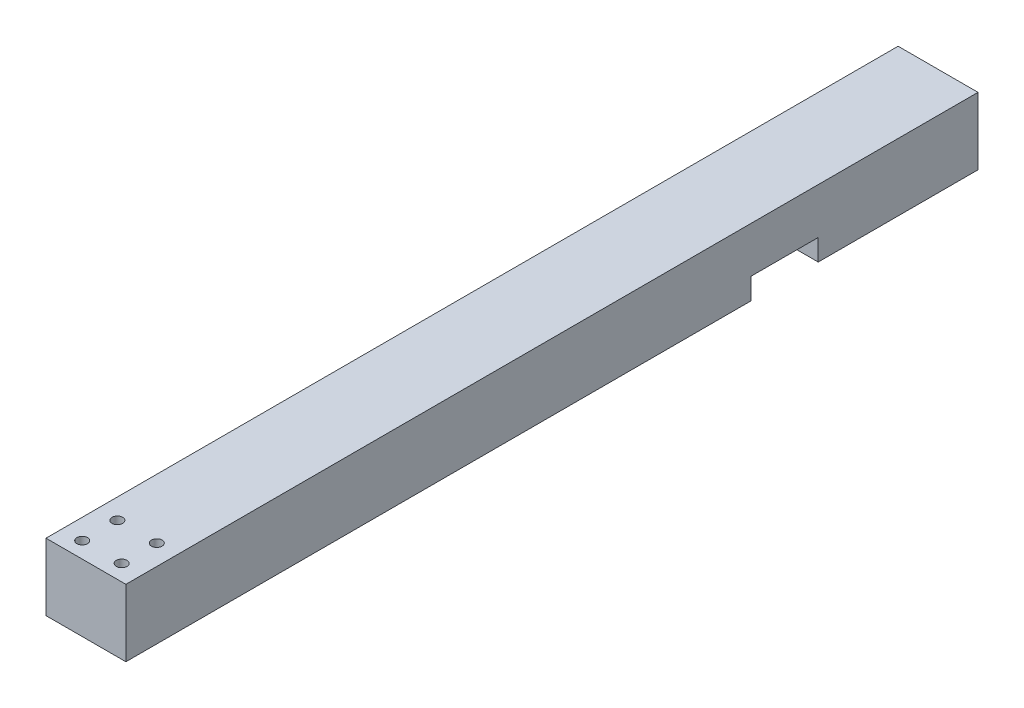
ISO-10303-21;
HEADER;
FILE_DESCRIPTION(('STEP AP214'),'2;1');
FILE_NAME('part.step','',(''),(''),'','','');
FILE_SCHEMA(('AUTOMOTIVE_DESIGN { 1 0 10303 214 1 1 1 1 }'));
ENDSEC;
DATA;
#1=APPLICATION_CONTEXT('core data for automotive mechanical design processes');
#2=APPLICATION_PROTOCOL_DEFINITION('international standard','automotive_design',2000,#1);
#3=PRODUCT_CONTEXT('',#1,'mechanical');
#4=PRODUCT('Part','Part','',(#3));
#5=PRODUCT_RELATED_PRODUCT_CATEGORY('part','',(#4));
#6=PRODUCT_DEFINITION_FORMATION('','',#4);
#7=PRODUCT_DEFINITION_CONTEXT('part definition',#1,'design');
#8=PRODUCT_DEFINITION('design','',#6,#7);
#9=PRODUCT_DEFINITION_SHAPE('','',#8);
#10=(LENGTH_UNIT() NAMED_UNIT(*) SI_UNIT(.MILLI.,.METRE.));
#11=(NAMED_UNIT(*) PLANE_ANGLE_UNIT() SI_UNIT($,.RADIAN.));
#12=(NAMED_UNIT(*) SI_UNIT($,.STERADIAN.) SOLID_ANGLE_UNIT());
#13=UNCERTAINTY_MEASURE_WITH_UNIT(LENGTH_MEASURE(1.E-05),#10,'distance_accuracy_value','');
#14=(GEOMETRIC_REPRESENTATION_CONTEXT(3) GLOBAL_UNCERTAINTY_ASSIGNED_CONTEXT((#13)) GLOBAL_UNIT_ASSIGNED_CONTEXT((#10,
#11,#12)) REPRESENTATION_CONTEXT('',''));
#15=CARTESIAN_POINT('',(0.,0.,0.));
#16=DIRECTION('',(0.,0.,1.));
#17=DIRECTION('',(1.,0.,0.));
#18=AXIS2_PLACEMENT_3D('',#15,#16,#17);
#19=CARTESIAN_POINT('',(0.,0.,800.));
#20=DIRECTION('',(0.,1.,0.));
#21=DIRECTION('',(0.,0.,1.));
#22=AXIS2_PLACEMENT_3D('',#19,#20,#21);
#23=PLANE('',#22);
#24=CARTESIAN_POINT('',(19.,0.,752.));
#25=DIRECTION('',(0.,-1.,0.));
#26=DIRECTION('',(0.,0.,-1.));
#27=AXIS2_PLACEMENT_3D('',#24,#25,#26);
#28=CIRCLE('',#27,5.);
#29=CARTESIAN_POINT('',(19.,0.,747.));
#30=VERTEX_POINT('',#29);
#31=EDGE_CURVE('E135',#30,#30,#28,.T.);
#32=ORIENTED_EDGE('',*,*,#31,.F.);
#33=EDGE_LOOP('',(#32));
#34=FACE_BOUND('',#33,.T.);
#35=CARTESIAN_POINT('',(56.,0.,752.));
#36=DIRECTION('',(0.,-1.,0.));
#37=DIRECTION('',(0.,0.,1.));
#38=AXIS2_PLACEMENT_3D('',#35,#36,#37);
#39=CIRCLE('',#38,5.00000000000001);
#40=CARTESIAN_POINT('',(56.,0.,757.));
#41=VERTEX_POINT('',#40);
#42=EDGE_CURVE('E148',#41,#41,#39,.T.);
#43=ORIENTED_EDGE('',*,*,#42,.F.);
#44=EDGE_LOOP('',(#43));
#45=FACE_BOUND('',#44,.T.);
#46=CARTESIAN_POINT('',(56.,0.,785.));
#47=DIRECTION('',(0.,-1.,0.));
#48=DIRECTION('',(0.,0.,1.));
#49=AXIS2_PLACEMENT_3D('',#46,#47,#48);
#50=CIRCLE('',#49,5.00000000000001);
#51=CARTESIAN_POINT('',(56.,0.,790.));
#52=VERTEX_POINT('',#51);
#53=EDGE_CURVE('E142',#52,#52,#50,.T.);
#54=ORIENTED_EDGE('',*,*,#53,.F.);
#55=EDGE_LOOP('',(#54));
#56=FACE_BOUND('',#55,.T.);
#57=CARTESIAN_POINT('',(19.,0.,785.));
#58=DIRECTION('',(0.,-1.,0.));
#59=DIRECTION('',(0.,0.,-1.));
#60=AXIS2_PLACEMENT_3D('',#57,#58,#59);
#61=CIRCLE('',#60,5.);
#62=CARTESIAN_POINT('',(19.,0.,780.));
#63=VERTEX_POINT('',#62);
#64=EDGE_CURVE('E136',#63,#63,#61,.T.);
#65=ORIENTED_EDGE('',*,*,#64,.F.);
#66=EDGE_LOOP('',(#65));
#67=FACE_BOUND('',#66,.T.);
#68=DIRECTION('',(0.,0.,-1.));
#69=VECTOR('',#68,1.);
#70=CARTESIAN_POINT('',(0.,0.,800.));
#71=LINE('',#70,#69);
#72=CARTESIAN_POINT('',(0.,0.,800.));
#73=VERTEX_POINT('',#72);
#74=CARTESIAN_POINT('',(0.,0.,213.));
#75=VERTEX_POINT('',#74);
#76=EDGE_CURVE('E11',#73,#75,#71,.T.);
#77=ORIENTED_EDGE('',*,*,#76,.T.);
#78=DIRECTION('',(-1.,0.,0.));
#79=VECTOR('',#78,1.);
#80=CARTESIAN_POINT('',(0.,0.,213.));
#81=LINE('',#80,#79);
#82=CARTESIAN_POINT('',(75.,0.,213.));
#83=VERTEX_POINT('',#82);
#84=EDGE_CURVE('E122',#83,#75,#81,.T.);
#85=ORIENTED_EDGE('',*,*,#84,.F.);
#86=DIRECTION('',(0.,0.,-1.));
#87=VECTOR('',#86,1.);
#88=CARTESIAN_POINT('',(75.,0.,800.));
#89=LINE('',#88,#87);
#90=CARTESIAN_POINT('',(75.,0.,800.));
#91=VERTEX_POINT('',#90);
#92=EDGE_CURVE('E175',#91,#83,#89,.T.);
#93=ORIENTED_EDGE('',*,*,#92,.F.);
#94=DIRECTION('',(1.,0.,0.));
#95=VECTOR('',#94,1.);
#96=CARTESIAN_POINT('',(0.,0.,800.));
#97=LINE('',#96,#95);
#98=EDGE_CURVE('E85',#73,#91,#97,.T.);
#99=ORIENTED_EDGE('',*,*,#98,.F.);
#100=EDGE_LOOP('',(#77,#85,#93,#99));
#101=FACE_BOUND('',#100,.T.);
#102=ADVANCED_FACE('F33',(#34,#45,#56,#67,#101),#23,.F.);
#103=CARTESIAN_POINT('',(0.,0.,800.));
#104=DIRECTION('',(1.,0.,0.));
#105=DIRECTION('',(0.,0.,-1.));
#106=AXIS2_PLACEMENT_3D('',#103,#104,#105);
#107=PLANE('',#106);
#108=DIRECTION('',(0.,0.,-1.));
#109=VECTOR('',#108,1.);
#110=CARTESIAN_POINT('',(0.,20.,150.));
#111=LINE('',#110,#109);
#112=CARTESIAN_POINT('',(0.,20.,213.));
#113=VERTEX_POINT('',#112);
#114=CARTESIAN_POINT('',(0.,20.,150.));
#115=VERTEX_POINT('',#114);
#116=EDGE_CURVE('E113',#113,#115,#111,.T.);
#117=ORIENTED_EDGE('',*,*,#116,.F.);
#118=DIRECTION('',(0.,-1.,0.));
#119=VECTOR('',#118,1.);
#120=CARTESIAN_POINT('',(0.,20.,213.));
#121=LINE('',#120,#119);
#122=EDGE_CURVE('E151',#113,#75,#121,.T.);
#123=ORIENTED_EDGE('',*,*,#122,.T.);
#124=ORIENTED_EDGE('',*,*,#76,.F.);
#125=DIRECTION('',(0.,-1.,0.));
#126=VECTOR('',#125,1.);
#127=CARTESIAN_POINT('',(0.,0.,800.));
#128=LINE('',#127,#126);
#129=CARTESIAN_POINT('',(0.,63.,800.));
#130=VERTEX_POINT('',#129);
#131=EDGE_CURVE('E158',#130,#73,#128,.T.);
#132=ORIENTED_EDGE('',*,*,#131,.F.);
#133=DIRECTION('',(0.,0.,-1.));
#134=VECTOR('',#133,1.);
#135=CARTESIAN_POINT('',(0.,63.,800.));
#136=LINE('',#135,#134);
#137=CARTESIAN_POINT('',(0.,63.,0.));
#138=VERTEX_POINT('',#137);
#139=EDGE_CURVE('E164',#130,#138,#136,.T.);
#140=ORIENTED_EDGE('',*,*,#139,.T.);
#141=DIRECTION('',(0.,-1.,0.));
#142=VECTOR('',#141,1.);
#143=CARTESIAN_POINT('',(0.,0.,0.));
#144=LINE('',#143,#142);
#145=CARTESIAN_POINT('',(0.,0.,0.));
#146=VERTEX_POINT('',#145);
#147=EDGE_CURVE('E155',#138,#146,#144,.T.);
#148=ORIENTED_EDGE('',*,*,#147,.T.);
#149=CARTESIAN_POINT('',(0.,0.,150.));
#150=VERTEX_POINT('',#149);
#151=EDGE_CURVE('E41',#150,#146,#71,.T.);
#152=ORIENTED_EDGE('',*,*,#151,.F.);
#153=DIRECTION('',(0.,-1.,0.));
#154=VECTOR('',#153,1.);
#155=CARTESIAN_POINT('',(0.,20.,150.));
#156=LINE('',#155,#154);
#157=EDGE_CURVE('E107',#115,#150,#156,.T.);
#158=ORIENTED_EDGE('',*,*,#157,.F.);
#159=EDGE_LOOP('',(#117,#123,#124,#132,#140,#148,#152,#158));
#160=FACE_BOUND('',#159,.T.);
#161=ADVANCED_FACE('F35',(#160),#107,.F.);
#162=CARTESIAN_POINT('',(75.,0.,150.));
#163=VERTEX_POINT('',#162);
#164=CARTESIAN_POINT('',(75.,0.,0.));
#165=VERTEX_POINT('',#164);
#166=EDGE_CURVE('E174',#163,#165,#89,.T.);
#167=ORIENTED_EDGE('',*,*,#166,.F.);
#168=DIRECTION('',(1.,0.,0.));
#169=VECTOR('',#168,1.);
#170=CARTESIAN_POINT('',(0.,0.,150.));
#171=LINE('',#170,#169);
#172=EDGE_CURVE('E196',#150,#163,#171,.T.);
#173=ORIENTED_EDGE('',*,*,#172,.F.);
#174=ORIENTED_EDGE('',*,*,#151,.T.);
#175=DIRECTION('',(1.,0.,0.));
#176=VECTOR('',#175,1.);
#177=CARTESIAN_POINT('',(0.,0.,0.));
#178=LINE('',#177,#176);
#179=EDGE_CURVE('E166',#146,#165,#178,.T.);
#180=ORIENTED_EDGE('',*,*,#179,.T.);
#181=EDGE_LOOP('',(#167,#173,#174,#180));
#182=FACE_BOUND('',#181,.T.);
#183=ADVANCED_FACE('F186',(#182),#23,.F.);
#184=CARTESIAN_POINT('',(75.,0.,800.));
#185=DIRECTION('',(-1.,0.,0.));
#186=DIRECTION('',(0.,0.,1.));
#187=AXIS2_PLACEMENT_3D('',#184,#185,#186);
#188=PLANE('',#187);
#189=ORIENTED_EDGE('',*,*,#92,.T.);
#190=DIRECTION('',(0.,-1.,0.));
#191=VECTOR('',#190,1.);
#192=CARTESIAN_POINT('',(75.,20.,213.));
#193=LINE('',#192,#191);
#194=CARTESIAN_POINT('',(75.,20.,213.));
#195=VERTEX_POINT('',#194);
#196=EDGE_CURVE('E127',#195,#83,#193,.T.);
#197=ORIENTED_EDGE('',*,*,#196,.F.);
#198=DIRECTION('',(0.,0.,1.));
#199=VECTOR('',#198,1.);
#200=CARTESIAN_POINT('',(75.,20.,150.));
#201=LINE('',#200,#199);
#202=CARTESIAN_POINT('',(75.,20.,150.));
#203=VERTEX_POINT('',#202);
#204=EDGE_CURVE('E112',#203,#195,#201,.T.);
#205=ORIENTED_EDGE('',*,*,#204,.F.);
#206=DIRECTION('',(0.,-1.,0.));
#207=VECTOR('',#206,1.);
#208=CARTESIAN_POINT('',(75.,20.,150.));
#209=LINE('',#208,#207);
#210=EDGE_CURVE('E110',#203,#163,#209,.T.);
#211=ORIENTED_EDGE('',*,*,#210,.T.);
#212=ORIENTED_EDGE('',*,*,#166,.T.);
#213=DIRECTION('',(0.,1.,0.));
#214=VECTOR('',#213,1.);
#215=CARTESIAN_POINT('',(75.,0.,0.));
#216=LINE('',#215,#214);
#217=CARTESIAN_POINT('',(75.,63.,0.));
#218=VERTEX_POINT('',#217);
#219=EDGE_CURVE('E169',#165,#218,#216,.T.);
#220=ORIENTED_EDGE('',*,*,#219,.T.);
#221=DIRECTION('',(0.,0.,-1.));
#222=VECTOR('',#221,1.);
#223=CARTESIAN_POINT('',(75.,63.,800.));
#224=LINE('',#223,#222);
#225=CARTESIAN_POINT('',(75.,63.,800.));
#226=VERTEX_POINT('',#225);
#227=EDGE_CURVE('E173',#226,#218,#224,.T.);
#228=ORIENTED_EDGE('',*,*,#227,.F.);
#229=DIRECTION('',(0.,1.,0.));
#230=VECTOR('',#229,1.);
#231=CARTESIAN_POINT('',(75.,0.,800.));
#232=LINE('',#231,#230);
#233=EDGE_CURVE('E161',#91,#226,#232,.T.);
#234=ORIENTED_EDGE('',*,*,#233,.F.);
#235=EDGE_LOOP('',(#189,#197,#205,#211,#212,#220,#228,#234));
#236=FACE_BOUND('',#235,.T.);
#237=ADVANCED_FACE('F181',(#236),#188,.F.);
#238=CARTESIAN_POINT('',(0.,63.,800.));
#239=DIRECTION('',(0.,-1.,0.));
#240=DIRECTION('',(0.,0.,-1.));
#241=AXIS2_PLACEMENT_3D('',#238,#239,#240);
#242=PLANE('',#241);
#243=CARTESIAN_POINT('',(19.,63.,785.));
#244=DIRECTION('',(0.,-1.,0.));
#245=DIRECTION('',(0.,0.,-1.));
#246=AXIS2_PLACEMENT_3D('',#243,#244,#245);
#247=CIRCLE('',#246,5.);
#248=CARTESIAN_POINT('',(19.,63.,780.));
#249=VERTEX_POINT('',#248);
#250=EDGE_CURVE('E132',#249,#249,#247,.T.);
#251=ORIENTED_EDGE('',*,*,#250,.T.);
#252=EDGE_LOOP('',(#251));
#253=FACE_BOUND('',#252,.T.);
#254=CARTESIAN_POINT('',(56.,63.,785.));
#255=DIRECTION('',(0.,-1.,0.));
#256=DIRECTION('',(0.,0.,1.));
#257=AXIS2_PLACEMENT_3D('',#254,#255,#256);
#258=CIRCLE('',#257,5.00000000000001);
#259=CARTESIAN_POINT('',(56.,63.,790.));
#260=VERTEX_POINT('',#259);
#261=EDGE_CURVE('E139',#260,#260,#258,.T.);
#262=ORIENTED_EDGE('',*,*,#261,.T.);
#263=EDGE_LOOP('',(#262));
#264=FACE_BOUND('',#263,.T.);
#265=CARTESIAN_POINT('',(56.,63.,752.));
#266=DIRECTION('',(0.,-1.,0.));
#267=DIRECTION('',(0.,0.,1.));
#268=AXIS2_PLACEMENT_3D('',#265,#266,#267);
#269=CIRCLE('',#268,5.00000000000001);
#270=CARTESIAN_POINT('',(56.,63.,757.));
#271=VERTEX_POINT('',#270);
#272=EDGE_CURVE('E145',#271,#271,#269,.T.);
#273=ORIENTED_EDGE('',*,*,#272,.T.);
#274=EDGE_LOOP('',(#273));
#275=FACE_BOUND('',#274,.T.);
#276=CARTESIAN_POINT('',(19.,63.,752.));
#277=DIRECTION('',(0.,-1.,0.));
#278=DIRECTION('',(0.,0.,-1.));
#279=AXIS2_PLACEMENT_3D('',#276,#277,#278);
#280=CIRCLE('',#279,5.);
#281=CARTESIAN_POINT('',(19.,63.,747.));
#282=VERTEX_POINT('',#281);
#283=EDGE_CURVE('E152',#282,#282,#280,.T.);
#284=ORIENTED_EDGE('',*,*,#283,.T.);
#285=EDGE_LOOP('',(#284));
#286=FACE_BOUND('',#285,.T.);
#287=DIRECTION('',(-1.,0.,0.));
#288=VECTOR('',#287,1.);
#289=CARTESIAN_POINT('',(0.,63.,0.));
#290=LINE('',#289,#288);
#291=EDGE_CURVE('E78',#218,#138,#290,.T.);
#292=ORIENTED_EDGE('',*,*,#291,.T.);
#293=ORIENTED_EDGE('',*,*,#139,.F.);
#294=DIRECTION('',(-1.,0.,0.));
#295=VECTOR('',#294,1.);
#296=CARTESIAN_POINT('',(0.,63.,800.));
#297=LINE('',#296,#295);
#298=EDGE_CURVE('E57',#226,#130,#297,.T.);
#299=ORIENTED_EDGE('',*,*,#298,.F.);
#300=ORIENTED_EDGE('',*,*,#227,.T.);
#301=EDGE_LOOP('',(#292,#293,#299,#300));
#302=FACE_BOUND('',#301,.T.);
#303=ADVANCED_FACE('F192',(#253,#264,#275,#286,#302),#242,.F.);
#304=CARTESIAN_POINT('',(0.,0.,800.));
#305=DIRECTION('',(0.,0.,-1.));
#306=DIRECTION('',(-1.,0.,0.));
#307=AXIS2_PLACEMENT_3D('',#304,#305,#306);
#308=PLANE('',#307);
#309=ORIENTED_EDGE('',*,*,#131,.T.);
#310=ORIENTED_EDGE('',*,*,#98,.T.);
#311=ORIENTED_EDGE('',*,*,#233,.T.);
#312=ORIENTED_EDGE('',*,*,#298,.T.);
#313=EDGE_LOOP('',(#309,#310,#311,#312));
#314=FACE_BOUND('',#313,.T.);
#315=ADVANCED_FACE('F193',(#314),#308,.F.);
#316=CARTESIAN_POINT('',(0.,0.,0.));
#317=DIRECTION('',(0.,0.,-1.));
#318=DIRECTION('',(-1.,0.,0.));
#319=AXIS2_PLACEMENT_3D('',#316,#317,#318);
#320=PLANE('',#319);
#321=ORIENTED_EDGE('',*,*,#147,.F.);
#322=ORIENTED_EDGE('',*,*,#291,.F.);
#323=ORIENTED_EDGE('',*,*,#219,.F.);
#324=ORIENTED_EDGE('',*,*,#179,.F.);
#325=EDGE_LOOP('',(#321,#322,#323,#324));
#326=FACE_BOUND('',#325,.T.);
#327=ADVANCED_FACE('F189',(#326),#320,.T.);
#328=CARTESIAN_POINT('',(19.,63.,752.));
#329=DIRECTION('',(0.,-1.,0.));
#330=DIRECTION('',(0.,0.,-1.));
#331=AXIS2_PLACEMENT_3D('',#328,#329,#330);
#332=CYLINDRICAL_SURFACE('',#331,5.);
#333=ORIENTED_EDGE('',*,*,#283,.F.);
#334=EDGE_LOOP('',(#333));
#335=FACE_BOUND('',#334,.T.);
#336=ORIENTED_EDGE('',*,*,#31,.T.);
#337=EDGE_LOOP('',(#336));
#338=FACE_BOUND('',#337,.T.);
#339=ADVANCED_FACE('F234',(#335,#338),#332,.F.);
#340=CARTESIAN_POINT('',(56.,63.,752.));
#341=DIRECTION('',(0.,-1.,0.));
#342=DIRECTION('',(0.,0.,-1.));
#343=AXIS2_PLACEMENT_3D('',#340,#341,#342);
#344=CYLINDRICAL_SURFACE('',#343,5.00000000000001);
#345=ORIENTED_EDGE('',*,*,#272,.F.);
#346=EDGE_LOOP('',(#345));
#347=FACE_BOUND('',#346,.T.);
#348=ORIENTED_EDGE('',*,*,#42,.T.);
#349=EDGE_LOOP('',(#348));
#350=FACE_BOUND('',#349,.T.);
#351=ADVANCED_FACE('F239',(#347,#350),#344,.F.);
#352=CARTESIAN_POINT('',(56.,63.,785.));
#353=DIRECTION('',(0.,-1.,0.));
#354=DIRECTION('',(0.,0.,-1.));
#355=AXIS2_PLACEMENT_3D('',#352,#353,#354);
#356=CYLINDRICAL_SURFACE('',#355,5.00000000000001);
#357=ORIENTED_EDGE('',*,*,#261,.F.);
#358=EDGE_LOOP('',(#357));
#359=FACE_BOUND('',#358,.T.);
#360=ORIENTED_EDGE('',*,*,#53,.T.);
#361=EDGE_LOOP('',(#360));
#362=FACE_BOUND('',#361,.T.);
#363=ADVANCED_FACE('F210',(#359,#362),#356,.F.);
#364=CARTESIAN_POINT('',(19.,63.,785.));
#365=DIRECTION('',(0.,-1.,0.));
#366=DIRECTION('',(0.,0.,-1.));
#367=AXIS2_PLACEMENT_3D('',#364,#365,#366);
#368=CYLINDRICAL_SURFACE('',#367,5.);
#369=ORIENTED_EDGE('',*,*,#250,.F.);
#370=EDGE_LOOP('',(#369));
#371=FACE_BOUND('',#370,.T.);
#372=ORIENTED_EDGE('',*,*,#64,.T.);
#373=EDGE_LOOP('',(#372));
#374=FACE_BOUND('',#373,.T.);
#375=ADVANCED_FACE('F203',(#371,#374),#368,.F.);
#376=CARTESIAN_POINT('',(0.,20.,213.));
#377=DIRECTION('',(0.,0.,1.));
#378=DIRECTION('',(1.,0.,0.));
#379=AXIS2_PLACEMENT_3D('',#376,#377,#378);
#380=PLANE('',#379);
#381=ORIENTED_EDGE('',*,*,#84,.T.);
#382=ORIENTED_EDGE('',*,*,#122,.F.);
#383=DIRECTION('',(-1.,0.,0.));
#384=VECTOR('',#383,1.);
#385=CARTESIAN_POINT('',(0.,20.,213.));
#386=LINE('',#385,#384);
#387=EDGE_CURVE('E119',#195,#113,#386,.T.);
#388=ORIENTED_EDGE('',*,*,#387,.F.);
#389=ORIENTED_EDGE('',*,*,#196,.T.);
#390=EDGE_LOOP('',(#381,#382,#388,#389));
#391=FACE_BOUND('',#390,.T.);
#392=ADVANCED_FACE('F200',(#391),#380,.F.);
#393=CARTESIAN_POINT('',(0.,20.,150.));
#394=DIRECTION('',(0.,0.,-1.));
#395=DIRECTION('',(-1.,0.,0.));
#396=AXIS2_PLACEMENT_3D('',#393,#394,#395);
#397=PLANE('',#396);
#398=ORIENTED_EDGE('',*,*,#172,.T.);
#399=ORIENTED_EDGE('',*,*,#210,.F.);
#400=DIRECTION('',(1.,0.,0.));
#401=VECTOR('',#400,1.);
#402=CARTESIAN_POINT('',(0.,20.,150.));
#403=LINE('',#402,#401);
#404=EDGE_CURVE('E48',#115,#203,#403,.T.);
#405=ORIENTED_EDGE('',*,*,#404,.F.);
#406=ORIENTED_EDGE('',*,*,#157,.T.);
#407=EDGE_LOOP('',(#398,#399,#405,#406));
#408=FACE_BOUND('',#407,.T.);
#409=ADVANCED_FACE('F105',(#408),#397,.F.);
#410=CARTESIAN_POINT('',(0.,20.,0.));
#411=DIRECTION('',(0.,1.,0.));
#412=DIRECTION('',(0.,0.,1.));
#413=AXIS2_PLACEMENT_3D('',#410,#411,#412);
#414=PLANE('',#413);
#415=ORIENTED_EDGE('',*,*,#116,.T.);
#416=ORIENTED_EDGE('',*,*,#404,.T.);
#417=ORIENTED_EDGE('',*,*,#204,.T.);
#418=ORIENTED_EDGE('',*,*,#387,.T.);
#419=EDGE_LOOP('',(#415,#416,#417,#418));
#420=FACE_BOUND('',#419,.T.);
#421=ADVANCED_FACE('F117',(#420),#414,.F.);
#422=CLOSED_SHELL('',(#102,#161,#183,#237,#303,#315,#327,#339,#351,#363,#375,#392,#409,#421));
#423=MANIFOLD_SOLID_BREP('B2',#422);
#424=ADVANCED_BREP_SHAPE_REPRESENTATION('',(#18,#423),#14);
#425=SHAPE_DEFINITION_REPRESENTATION(#9,#424);
ENDSEC;
END-ISO-10303-21;
